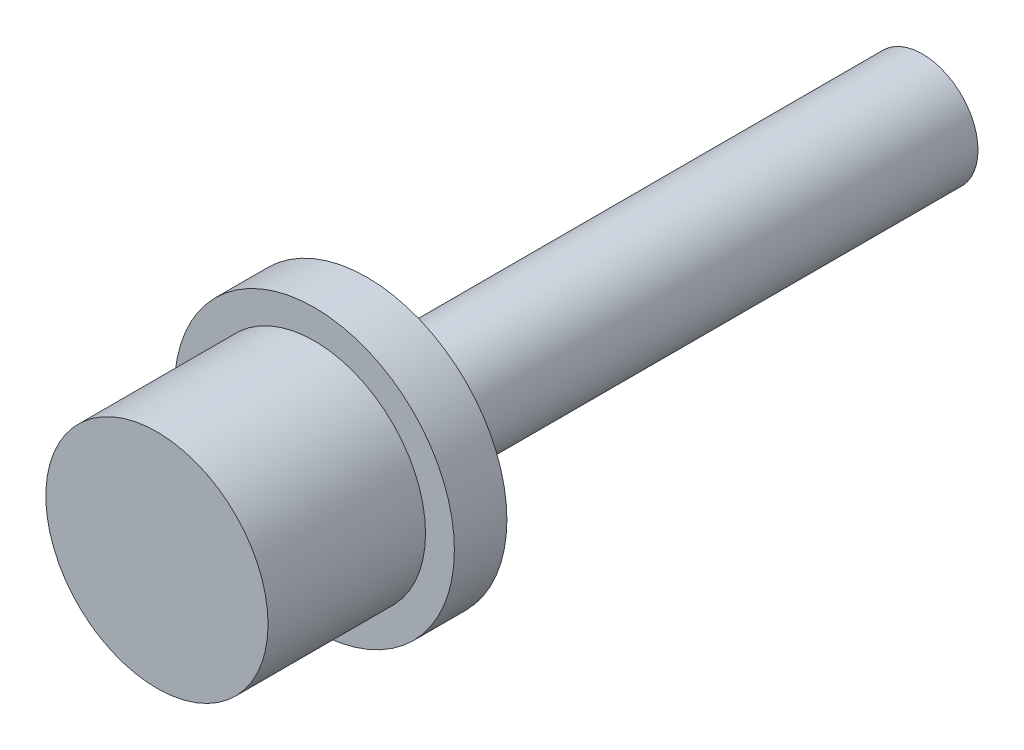
ISO-10303-21;
HEADER;
FILE_DESCRIPTION(('STEP AP214'),'2;1');
FILE_NAME('part.step','',(''),(''),'','','');
FILE_SCHEMA(('AUTOMOTIVE_DESIGN { 1 0 10303 214 1 1 1 1 }'));
ENDSEC;
DATA;
#1=APPLICATION_CONTEXT('core data for automotive mechanical design processes');
#2=APPLICATION_PROTOCOL_DEFINITION('international standard','automotive_design',2000,#1);
#3=PRODUCT_CONTEXT('',#1,'mechanical');
#4=PRODUCT('Part','Part','',(#3));
#5=PRODUCT_RELATED_PRODUCT_CATEGORY('part','',(#4));
#6=PRODUCT_DEFINITION_FORMATION('','',#4);
#7=PRODUCT_DEFINITION_CONTEXT('part definition',#1,'design');
#8=PRODUCT_DEFINITION('design','',#6,#7);
#9=PRODUCT_DEFINITION_SHAPE('','',#8);
#10=(LENGTH_UNIT() NAMED_UNIT(*) SI_UNIT(.MILLI.,.METRE.));
#11=(NAMED_UNIT(*) PLANE_ANGLE_UNIT() SI_UNIT($,.RADIAN.));
#12=(NAMED_UNIT(*) SI_UNIT($,.STERADIAN.) SOLID_ANGLE_UNIT());
#13=UNCERTAINTY_MEASURE_WITH_UNIT(LENGTH_MEASURE(1.E-05),#10,'distance_accuracy_value','');
#14=(GEOMETRIC_REPRESENTATION_CONTEXT(3) GLOBAL_UNCERTAINTY_ASSIGNED_CONTEXT((#13)) GLOBAL_UNIT_ASSIGNED_CONTEXT((#10,
#11,#12)) REPRESENTATION_CONTEXT('',''));
#15=CARTESIAN_POINT('',(0.,0.,0.));
#16=DIRECTION('',(0.,0.,1.));
#17=DIRECTION('',(1.,0.,0.));
#18=AXIS2_PLACEMENT_3D('',#15,#16,#17);
#19=CARTESIAN_POINT('',(-65.,0.,280.65));
#20=DIRECTION('',(0.,0.,1.));
#21=DIRECTION('',(1.,0.,0.));
#22=AXIS2_PLACEMENT_3D('',#19,#20,#21);
#23=PLANE('',#22);
#24=CARTESIAN_POINT('',(-65.,0.,280.65));
#25=DIRECTION('',(0.,0.,1.));
#26=DIRECTION('',(1.,0.,0.));
#27=AXIS2_PLACEMENT_3D('',#24,#25,#26);
#28=CIRCLE('',#27,3.175);
#29=CARTESIAN_POINT('',(-61.825,0.,280.65));
#30=VERTEX_POINT('',#29);
#31=EDGE_CURVE('E10',#30,#30,#28,.T.);
#32=ORIENTED_EDGE('',*,*,#31,.F.);
#33=EDGE_LOOP('',(#32));
#34=FACE_BOUND('',#33,.T.);
#35=ADVANCED_FACE('F16',(#34),#23,.F.);
#36=CARTESIAN_POINT('',(-65.,0.,324.4));
#37=DIRECTION('',(0.,0.,1.));
#38=DIRECTION('',(1.,0.,0.));
#39=AXIS2_PLACEMENT_3D('',#36,#37,#38);
#40=PLANE('',#39);
#41=CARTESIAN_POINT('',(-65.,0.,324.4));
#42=DIRECTION('',(0.,0.,1.));
#43=DIRECTION('',(1.,0.,0.));
#44=AXIS2_PLACEMENT_3D('',#41,#42,#43);
#45=CIRCLE('',#44,6.35);
#46=CARTESIAN_POINT('',(-58.65,0.,324.4));
#47=VERTEX_POINT('',#46);
#48=EDGE_CURVE('E65',#47,#47,#45,.T.);
#49=ORIENTED_EDGE('',*,*,#48,.T.);
#50=EDGE_LOOP('',(#49));
#51=FACE_BOUND('',#50,.T.);
#52=ADVANCED_FACE('F85',(#51),#40,.T.);
#53=CARTESIAN_POINT('',(-65.,0.,280.65));
#54=DIRECTION('',(0.,0.,1.));
#55=DIRECTION('',(1.,0.,0.));
#56=AXIS2_PLACEMENT_3D('',#53,#54,#55);
#57=CYLINDRICAL_SURFACE('',#56,3.175);
#58=CARTESIAN_POINT('',(-65.,0.,312.4));
#59=DIRECTION('',(0.,0.,1.));
#60=DIRECTION('',(1.,0.,0.));
#61=AXIS2_PLACEMENT_3D('',#58,#59,#60);
#62=CIRCLE('',#61,3.175);
#63=CARTESIAN_POINT('',(-61.825,0.,312.4));
#64=VERTEX_POINT('',#63);
#65=EDGE_CURVE('E57',#64,#64,#62,.T.);
#66=ORIENTED_EDGE('',*,*,#65,.F.);
#67=DIRECTION('',(0.,0.,1.));
#68=VECTOR('',#67,1.);
#69=CARTESIAN_POINT('',(-61.825,0.,280.65));
#70=LINE('',#69,#68);
#71=EDGE_CURVE('E27',#30,#64,#70,.T.);
#72=ORIENTED_EDGE('',*,*,#71,.F.);
#73=ORIENTED_EDGE('',*,*,#31,.T.);
#74=ORIENTED_EDGE('',*,*,#71,.T.);
#75=EDGE_LOOP('',(#66,#72,#73,#74));
#76=FACE_BOUND('',#75,.T.);
#77=ADVANCED_FACE('F56',(#76),#57,.T.);
#78=CARTESIAN_POINT('',(-65.,0.,315.4));
#79=DIRECTION('',(0.,0.,1.));
#80=DIRECTION('',(1.,0.,0.));
#81=AXIS2_PLACEMENT_3D('',#78,#79,#80);
#82=CYLINDRICAL_SURFACE('',#81,6.35);
#83=ORIENTED_EDGE('',*,*,#48,.F.);
#84=DIRECTION('',(0.,0.,1.));
#85=VECTOR('',#84,1.);
#86=CARTESIAN_POINT('',(-58.65,0.,315.4));
#87=LINE('',#86,#85);
#88=CARTESIAN_POINT('',(-58.65,0.,315.4));
#89=VERTEX_POINT('',#88);
#90=EDGE_CURVE('E59',#89,#47,#87,.T.);
#91=ORIENTED_EDGE('',*,*,#90,.F.);
#92=CARTESIAN_POINT('',(-65.,0.,315.4));
#93=DIRECTION('',(0.,0.,1.));
#94=DIRECTION('',(1.,0.,0.));
#95=AXIS2_PLACEMENT_3D('',#92,#93,#94);
#96=CIRCLE('',#95,6.35);
#97=EDGE_CURVE('E66',#89,#89,#96,.T.);
#98=ORIENTED_EDGE('',*,*,#97,.T.);
#99=ORIENTED_EDGE('',*,*,#90,.T.);
#100=EDGE_LOOP('',(#83,#91,#98,#99));
#101=FACE_BOUND('',#100,.T.);
#102=ADVANCED_FACE('F18',(#101),#82,.T.);
#103=CARTESIAN_POINT('',(-65.,0.,312.4));
#104=DIRECTION('',(0.,0.,1.));
#105=DIRECTION('',(1.,0.,0.));
#106=AXIS2_PLACEMENT_3D('',#103,#104,#105);
#107=PLANE('',#106);
#108=ORIENTED_EDGE('',*,*,#65,.T.);
#109=EDGE_LOOP('',(#108));
#110=FACE_BOUND('',#109,.T.);
#111=CARTESIAN_POINT('',(-65.,0.,312.4));
#112=DIRECTION('',(0.,0.,1.));
#113=DIRECTION('',(1.,0.,0.));
#114=AXIS2_PLACEMENT_3D('',#111,#112,#113);
#115=CIRCLE('',#114,8.);
#116=CARTESIAN_POINT('',(-57.,0.,312.4));
#117=VERTEX_POINT('',#116);
#118=EDGE_CURVE('E75',#117,#117,#115,.T.);
#119=ORIENTED_EDGE('',*,*,#118,.F.);
#120=EDGE_LOOP('',(#119));
#121=FACE_BOUND('',#120,.T.);
#122=ADVANCED_FACE('F62',(#110,#121),#107,.F.);
#123=CARTESIAN_POINT('',(-65.,0.,315.4));
#124=DIRECTION('',(0.,0.,1.));
#125=DIRECTION('',(1.,0.,0.));
#126=AXIS2_PLACEMENT_3D('',#123,#124,#125);
#127=PLANE('',#126);
#128=ORIENTED_EDGE('',*,*,#97,.F.);
#129=EDGE_LOOP('',(#128));
#130=FACE_BOUND('',#129,.T.);
#131=CARTESIAN_POINT('',(-65.,0.,315.4));
#132=DIRECTION('',(0.,0.,1.));
#133=DIRECTION('',(1.,0.,0.));
#134=AXIS2_PLACEMENT_3D('',#131,#132,#133);
#135=CIRCLE('',#134,8.);
#136=CARTESIAN_POINT('',(-57.,0.,315.4));
#137=VERTEX_POINT('',#136);
#138=EDGE_CURVE('E20',#137,#137,#135,.T.);
#139=ORIENTED_EDGE('',*,*,#138,.T.);
#140=EDGE_LOOP('',(#139));
#141=FACE_BOUND('',#140,.T.);
#142=ADVANCED_FACE('F100',(#130,#141),#127,.T.);
#143=CARTESIAN_POINT('',(-65.,0.,312.4));
#144=DIRECTION('',(0.,0.,1.));
#145=DIRECTION('',(1.,0.,0.));
#146=AXIS2_PLACEMENT_3D('',#143,#144,#145);
#147=CYLINDRICAL_SURFACE('',#146,8.);
#148=ORIENTED_EDGE('',*,*,#138,.F.);
#149=DIRECTION('',(0.,0.,1.));
#150=VECTOR('',#149,1.);
#151=CARTESIAN_POINT('',(-57.,0.,312.4));
#152=LINE('',#151,#150);
#153=EDGE_CURVE('E173',#117,#137,#152,.T.);
#154=ORIENTED_EDGE('',*,*,#153,.F.);
#155=ORIENTED_EDGE('',*,*,#118,.T.);
#156=ORIENTED_EDGE('',*,*,#153,.T.);
#157=EDGE_LOOP('',(#148,#154,#155,#156));
#158=FACE_BOUND('',#157,.T.);
#159=ADVANCED_FACE('F96',(#158),#147,.T.);
#160=CLOSED_SHELL('',(#35,#52,#77,#102,#122,#142,#159));
#161=MANIFOLD_SOLID_BREP('B1',#160);
#162=ADVANCED_BREP_SHAPE_REPRESENTATION('',(#18,#161),#14);
#163=SHAPE_DEFINITION_REPRESENTATION(#9,#162);
ENDSEC;
END-ISO-10303-21;
